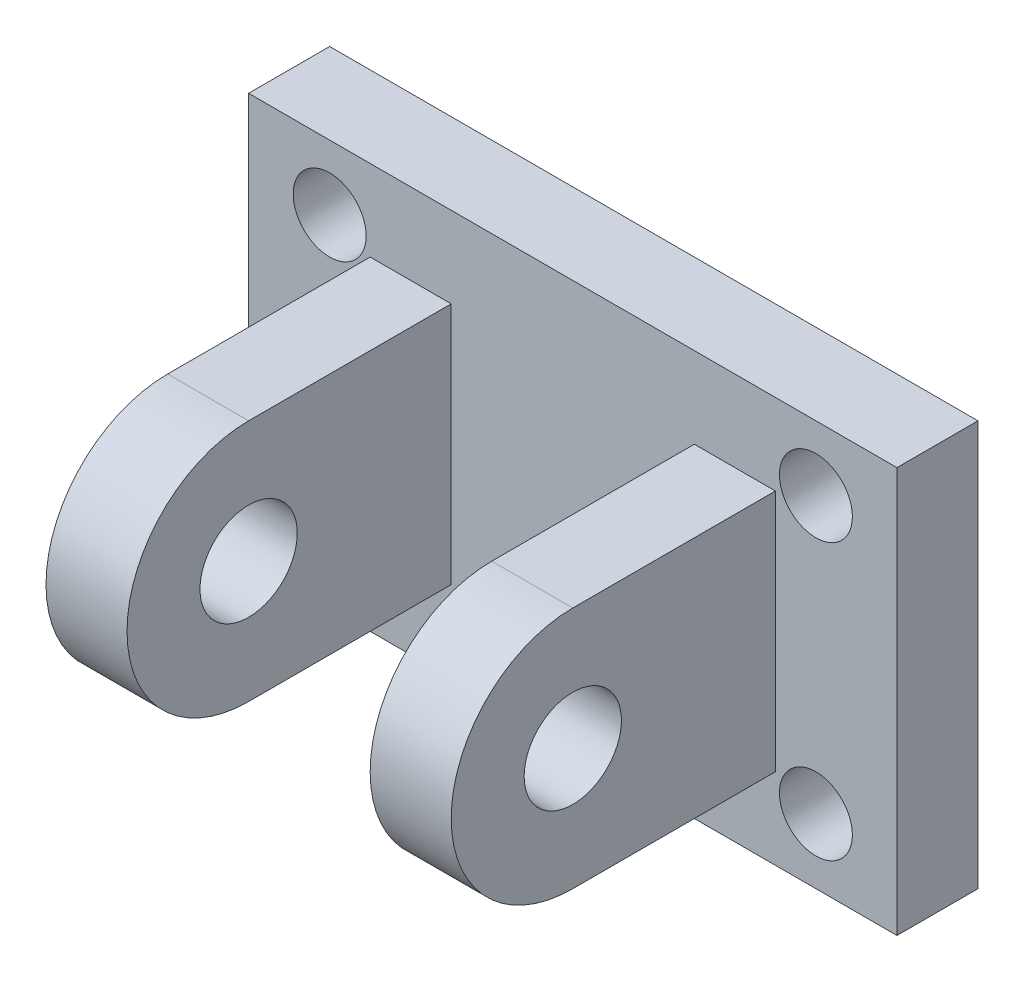
ISO-10303-21;
HEADER;
FILE_DESCRIPTION(('STEP AP214'),'2;1');
FILE_NAME('part.step','',(''),(''),'','','');
FILE_SCHEMA(('AUTOMOTIVE_DESIGN { 1 0 10303 214 1 1 1 1 }'));
ENDSEC;
DATA;
#1=APPLICATION_CONTEXT('core data for automotive mechanical design processes');
#2=APPLICATION_PROTOCOL_DEFINITION('international standard','automotive_design',2000,#1);
#3=PRODUCT_CONTEXT('',#1,'mechanical');
#4=PRODUCT('Part','Part','',(#3));
#5=PRODUCT_RELATED_PRODUCT_CATEGORY('part','',(#4));
#6=PRODUCT_DEFINITION_FORMATION('','',#4);
#7=PRODUCT_DEFINITION_CONTEXT('part definition',#1,'design');
#8=PRODUCT_DEFINITION('design','',#6,#7);
#9=PRODUCT_DEFINITION_SHAPE('','',#8);
#10=(LENGTH_UNIT() NAMED_UNIT(*) SI_UNIT(.MILLI.,.METRE.));
#11=(NAMED_UNIT(*) PLANE_ANGLE_UNIT() SI_UNIT($,.RADIAN.));
#12=(NAMED_UNIT(*) SI_UNIT($,.STERADIAN.) SOLID_ANGLE_UNIT());
#13=UNCERTAINTY_MEASURE_WITH_UNIT(LENGTH_MEASURE(1.E-05),#10,'distance_accuracy_value','');
#14=(GEOMETRIC_REPRESENTATION_CONTEXT(3) GLOBAL_UNCERTAINTY_ASSIGNED_CONTEXT((#13)) GLOBAL_UNIT_ASSIGNED_CONTEXT((#10,
#11,#12)) REPRESENTATION_CONTEXT('',''));
#15=CARTESIAN_POINT('',(0.,0.,0.));
#16=DIRECTION('',(0.,0.,1.));
#17=DIRECTION('',(1.,0.,0.));
#18=AXIS2_PLACEMENT_3D('',#15,#16,#17);
#19=CARTESIAN_POINT('',(0.,0.,10.));
#20=DIRECTION('',(0.,0.,1.));
#21=DIRECTION('',(1.,0.,0.));
#22=AXIS2_PLACEMENT_3D('',#19,#20,#21);
#23=PLANE('',#22);
#24=CARTESIAN_POINT('',(30.,-17.,10.));
#25=DIRECTION('',(0.,0.,1.));
#26=DIRECTION('',(1.,0.,0.));
#27=AXIS2_PLACEMENT_3D('',#24,#25,#26);
#28=CIRCLE('',#27,4.5);
#29=CARTESIAN_POINT('',(34.5,-17.,10.));
#30=VERTEX_POINT('',#29);
#31=EDGE_CURVE('E581',#30,#30,#28,.F.);
#32=ORIENTED_EDGE('',*,*,#31,.T.);
#33=EDGE_LOOP('',(#32));
#34=FACE_BOUND('',#33,.T.);
#35=CARTESIAN_POINT('',(-30.,17.,10.));
#36=DIRECTION('',(0.,0.,1.));
#37=DIRECTION('',(1.,0.,0.));
#38=AXIS2_PLACEMENT_3D('',#35,#36,#37);
#39=CIRCLE('',#38,4.5);
#40=CARTESIAN_POINT('',(-25.5,17.,10.));
#41=VERTEX_POINT('',#40);
#42=EDGE_CURVE('E587',#41,#41,#39,.F.);
#43=ORIENTED_EDGE('',*,*,#42,.T.);
#44=EDGE_LOOP('',(#43));
#45=FACE_BOUND('',#44,.T.);
#46=CARTESIAN_POINT('',(-30.,-17.,10.));
#47=DIRECTION('',(0.,0.,1.));
#48=DIRECTION('',(1.,0.,0.));
#49=AXIS2_PLACEMENT_3D('',#46,#47,#48);
#50=CIRCLE('',#49,4.5);
#51=CARTESIAN_POINT('',(-25.5,-17.,10.));
#52=VERTEX_POINT('',#51);
#53=EDGE_CURVE('E599',#52,#52,#50,.F.);
#54=ORIENTED_EDGE('',*,*,#53,.T.);
#55=EDGE_LOOP('',(#54));
#56=FACE_BOUND('',#55,.T.);
#57=CARTESIAN_POINT('',(30.,17.,10.));
#58=DIRECTION('',(0.,0.,1.));
#59=DIRECTION('',(1.,0.,0.));
#60=AXIS2_PLACEMENT_3D('',#57,#58,#59);
#61=CIRCLE('',#60,4.5);
#62=CARTESIAN_POINT('',(34.5,17.,10.));
#63=VERTEX_POINT('',#62);
#64=EDGE_CURVE('E597',#63,#63,#61,.F.);
#65=ORIENTED_EDGE('',*,*,#64,.T.);
#66=EDGE_LOOP('',(#65));
#67=FACE_BOUND('',#66,.T.);
#68=DIRECTION('',(0.,-1.,0.));
#69=VECTOR('',#68,1.);
#70=CARTESIAN_POINT('',(-40.,25.,10.));
#71=LINE('',#70,#69);
#72=CARTESIAN_POINT('',(-40.,25.,10.));
#73=VERTEX_POINT('',#72);
#74=CARTESIAN_POINT('',(-40.,-25.,10.));
#75=VERTEX_POINT('',#74);
#76=EDGE_CURVE('E210',#73,#75,#71,.T.);
#77=ORIENTED_EDGE('',*,*,#76,.T.);
#78=DIRECTION('',(1.,0.,0.));
#79=VECTOR('',#78,1.);
#80=CARTESIAN_POINT('',(-40.,-25.,10.));
#81=LINE('',#80,#79);
#82=CARTESIAN_POINT('',(40.,-25.,10.));
#83=VERTEX_POINT('',#82);
#84=EDGE_CURVE('E214',#75,#83,#81,.T.);
#85=ORIENTED_EDGE('',*,*,#84,.T.);
#86=DIRECTION('',(0.,1.,0.));
#87=VECTOR('',#86,1.);
#88=CARTESIAN_POINT('',(40.,-25.,10.));
#89=LINE('',#88,#87);
#90=CARTESIAN_POINT('',(40.,25.,10.));
#91=VERTEX_POINT('',#90);
#92=EDGE_CURVE('E218',#83,#91,#89,.T.);
#93=ORIENTED_EDGE('',*,*,#92,.T.);
#94=DIRECTION('',(-1.,0.,0.));
#95=VECTOR('',#94,1.);
#96=CARTESIAN_POINT('',(40.,25.,10.));
#97=LINE('',#96,#95);
#98=EDGE_CURVE('E221',#91,#73,#97,.T.);
#99=ORIENTED_EDGE('',*,*,#98,.T.);
#100=EDGE_LOOP('',(#77,#85,#93,#99));
#101=FACE_BOUND('',#100,.T.);
#102=DIRECTION('',(1.,0.,0.));
#103=VECTOR('',#102,1.);
#104=CARTESIAN_POINT('',(0.,15.,10.));
#105=LINE('',#104,#103);
#106=CARTESIAN_POINT('',(15.,15.,10.));
#107=VERTEX_POINT('',#106);
#108=CARTESIAN_POINT('',(25.,15.,10.));
#109=VERTEX_POINT('',#108);
#110=EDGE_CURVE('E258',#107,#109,#105,.T.);
#111=ORIENTED_EDGE('',*,*,#110,.T.);
#112=DIRECTION('',(0.,-1.,0.));
#113=VECTOR('',#112,1.);
#114=CARTESIAN_POINT('',(25.,0.,10.));
#115=LINE('',#114,#113);
#116=CARTESIAN_POINT('',(25.,-15.,10.));
#117=VERTEX_POINT('',#116);
#118=EDGE_CURVE('E261',#109,#117,#115,.T.);
#119=ORIENTED_EDGE('',*,*,#118,.T.);
#120=DIRECTION('',(-1.,0.,0.));
#121=VECTOR('',#120,1.);
#122=CARTESIAN_POINT('',(0.,-15.,10.));
#123=LINE('',#122,#121);
#124=CARTESIAN_POINT('',(15.,-15.,10.));
#125=VERTEX_POINT('',#124);
#126=EDGE_CURVE('E255',#117,#125,#123,.T.);
#127=ORIENTED_EDGE('',*,*,#126,.T.);
#128=DIRECTION('',(0.,-1.,0.));
#129=VECTOR('',#128,1.);
#130=CARTESIAN_POINT('',(15.,0.,10.));
#131=LINE('',#130,#129);
#132=EDGE_CURVE('E251',#107,#125,#131,.T.);
#133=ORIENTED_EDGE('',*,*,#132,.F.);
#134=EDGE_LOOP('',(#111,#119,#127,#133));
#135=FACE_BOUND('',#134,.T.);
#136=DIRECTION('',(1.,0.,0.));
#137=VECTOR('',#136,1.);
#138=CARTESIAN_POINT('',(0.,-15.,10.));
#139=LINE('',#138,#137);
#140=CARTESIAN_POINT('',(-25.,-15.,10.));
#141=VERTEX_POINT('',#140);
#142=CARTESIAN_POINT('',(-15.,-15.,10.));
#143=VERTEX_POINT('',#142);
#144=EDGE_CURVE('E62',#141,#143,#139,.T.);
#145=ORIENTED_EDGE('',*,*,#144,.F.);
#146=DIRECTION('',(0.,1.,0.));
#147=VECTOR('',#146,1.);
#148=CARTESIAN_POINT('',(-25.,0.,10.));
#149=LINE('',#148,#147);
#150=CARTESIAN_POINT('',(-25.,15.,10.));
#151=VERTEX_POINT('',#150);
#152=EDGE_CURVE('E11',#141,#151,#149,.T.);
#153=ORIENTED_EDGE('',*,*,#152,.T.);
#154=DIRECTION('',(-1.,0.,0.));
#155=VECTOR('',#154,1.);
#156=CARTESIAN_POINT('',(0.,15.,10.));
#157=LINE('',#156,#155);
#158=CARTESIAN_POINT('',(-15.,15.,10.));
#159=VERTEX_POINT('',#158);
#160=EDGE_CURVE('E267',#159,#151,#157,.T.);
#161=ORIENTED_EDGE('',*,*,#160,.F.);
#162=DIRECTION('',(0.,1.,0.));
#163=VECTOR('',#162,1.);
#164=CARTESIAN_POINT('',(-15.,0.,10.));
#165=LINE('',#164,#163);
#166=EDGE_CURVE('E264',#143,#159,#165,.T.);
#167=ORIENTED_EDGE('',*,*,#166,.F.);
#168=EDGE_LOOP('',(#145,#153,#161,#167));
#169=FACE_BOUND('',#168,.T.);
#170=ADVANCED_FACE('F51',(#34,#45,#56,#67,#101,#135,#169),#23,.T.);
#171=CARTESIAN_POINT('',(-40.,25.,10.));
#172=DIRECTION('',(1.,0.,0.));
#173=DIRECTION('',(0.,0.,-1.));
#174=AXIS2_PLACEMENT_3D('',#171,#172,#173);
#175=PLANE('',#174);
#176=DIRECTION('',(0.,-1.,0.));
#177=VECTOR('',#176,1.);
#178=CARTESIAN_POINT('',(-40.,25.,0.));
#179=LINE('',#178,#177);
#180=CARTESIAN_POINT('',(-40.,25.,0.));
#181=VERTEX_POINT('',#180);
#182=CARTESIAN_POINT('',(-40.,-25.,0.));
#183=VERTEX_POINT('',#182);
#184=EDGE_CURVE('E209',#181,#183,#179,.T.);
#185=ORIENTED_EDGE('',*,*,#184,.T.);
#186=DIRECTION('',(0.,0.,-1.));
#187=VECTOR('',#186,1.);
#188=CARTESIAN_POINT('',(-40.,-25.,10.));
#189=LINE('',#188,#187);
#190=EDGE_CURVE('E247',#75,#183,#189,.T.);
#191=ORIENTED_EDGE('',*,*,#190,.F.);
#192=ORIENTED_EDGE('',*,*,#76,.F.);
#193=DIRECTION('',(0.,0.,-1.));
#194=VECTOR('',#193,1.);
#195=CARTESIAN_POINT('',(-40.,25.,10.));
#196=LINE('',#195,#194);
#197=EDGE_CURVE('E224',#73,#181,#196,.T.);
#198=ORIENTED_EDGE('',*,*,#197,.T.);
#199=EDGE_LOOP('',(#185,#191,#192,#198));
#200=FACE_BOUND('',#199,.T.);
#201=ADVANCED_FACE('F54',(#200),#175,.F.);
#202=CARTESIAN_POINT('',(-40.,-25.,10.));
#203=DIRECTION('',(0.,1.,0.));
#204=DIRECTION('',(0.,0.,1.));
#205=AXIS2_PLACEMENT_3D('',#202,#203,#204);
#206=PLANE('',#205);
#207=DIRECTION('',(1.,0.,0.));
#208=VECTOR('',#207,1.);
#209=CARTESIAN_POINT('',(-40.,-25.,0.));
#210=LINE('',#209,#208);
#211=CARTESIAN_POINT('',(40.,-25.,0.));
#212=VERTEX_POINT('',#211);
#213=EDGE_CURVE('E228',#183,#212,#210,.T.);
#214=ORIENTED_EDGE('',*,*,#213,.T.);
#215=DIRECTION('',(0.,0.,-1.));
#216=VECTOR('',#215,1.);
#217=CARTESIAN_POINT('',(40.,-25.,10.));
#218=LINE('',#217,#216);
#219=EDGE_CURVE('E243',#83,#212,#218,.T.);
#220=ORIENTED_EDGE('',*,*,#219,.F.);
#221=ORIENTED_EDGE('',*,*,#84,.F.);
#222=ORIENTED_EDGE('',*,*,#190,.T.);
#223=EDGE_LOOP('',(#214,#220,#221,#222));
#224=FACE_BOUND('',#223,.T.);
#225=ADVANCED_FACE('F281',(#224),#206,.F.);
#226=CARTESIAN_POINT('',(40.,-25.,10.));
#227=DIRECTION('',(-1.,0.,0.));
#228=DIRECTION('',(0.,0.,1.));
#229=AXIS2_PLACEMENT_3D('',#226,#227,#228);
#230=PLANE('',#229);
#231=DIRECTION('',(0.,1.,0.));
#232=VECTOR('',#231,1.);
#233=CARTESIAN_POINT('',(40.,-25.,0.));
#234=LINE('',#233,#232);
#235=CARTESIAN_POINT('',(40.,25.,0.));
#236=VERTEX_POINT('',#235);
#237=EDGE_CURVE('E231',#212,#236,#234,.T.);
#238=ORIENTED_EDGE('',*,*,#237,.T.);
#239=DIRECTION('',(0.,0.,-1.));
#240=VECTOR('',#239,1.);
#241=CARTESIAN_POINT('',(40.,25.,10.));
#242=LINE('',#241,#240);
#243=EDGE_CURVE('E239',#91,#236,#242,.T.);
#244=ORIENTED_EDGE('',*,*,#243,.F.);
#245=ORIENTED_EDGE('',*,*,#92,.F.);
#246=ORIENTED_EDGE('',*,*,#219,.T.);
#247=EDGE_LOOP('',(#238,#244,#245,#246));
#248=FACE_BOUND('',#247,.T.);
#249=ADVANCED_FACE('F301',(#248),#230,.F.);
#250=CARTESIAN_POINT('',(40.,25.,10.));
#251=DIRECTION('',(0.,-1.,0.));
#252=DIRECTION('',(0.,0.,-1.));
#253=AXIS2_PLACEMENT_3D('',#250,#251,#252);
#254=PLANE('',#253);
#255=DIRECTION('',(-1.,0.,0.));
#256=VECTOR('',#255,1.);
#257=CARTESIAN_POINT('',(40.,25.,0.));
#258=LINE('',#257,#256);
#259=EDGE_CURVE('E215',#236,#181,#258,.T.);
#260=ORIENTED_EDGE('',*,*,#259,.T.);
#261=ORIENTED_EDGE('',*,*,#197,.F.);
#262=ORIENTED_EDGE('',*,*,#98,.F.);
#263=ORIENTED_EDGE('',*,*,#243,.T.);
#264=EDGE_LOOP('',(#260,#261,#262,#263));
#265=FACE_BOUND('',#264,.T.);
#266=ADVANCED_FACE('F296',(#265),#254,.F.);
#267=CARTESIAN_POINT('',(0.,0.,0.));
#268=DIRECTION('',(0.,0.,1.));
#269=DIRECTION('',(1.,0.,0.));
#270=AXIS2_PLACEMENT_3D('',#267,#268,#269);
#271=PLANE('',#270);
#272=CARTESIAN_POINT('',(30.,-17.,0.));
#273=DIRECTION('',(0.,0.,1.));
#274=DIRECTION('',(1.,0.,0.));
#275=AXIS2_PLACEMENT_3D('',#272,#273,#274);
#276=CIRCLE('',#275,4.5);
#277=CARTESIAN_POINT('',(34.5,-17.,0.));
#278=VERTEX_POINT('',#277);
#279=EDGE_CURVE('E604',#278,#278,#276,.T.);
#280=ORIENTED_EDGE('',*,*,#279,.T.);
#281=EDGE_LOOP('',(#280));
#282=FACE_BOUND('',#281,.T.);
#283=CARTESIAN_POINT('',(-30.,17.,0.));
#284=DIRECTION('',(0.,0.,1.));
#285=DIRECTION('',(1.,0.,0.));
#286=AXIS2_PLACEMENT_3D('',#283,#284,#285);
#287=CIRCLE('',#286,4.5);
#288=CARTESIAN_POINT('',(-25.5,17.,0.));
#289=VERTEX_POINT('',#288);
#290=EDGE_CURVE('E602',#289,#289,#287,.T.);
#291=ORIENTED_EDGE('',*,*,#290,.T.);
#292=EDGE_LOOP('',(#291));
#293=FACE_BOUND('',#292,.T.);
#294=CARTESIAN_POINT('',(-30.,-17.,0.));
#295=DIRECTION('',(0.,0.,1.));
#296=DIRECTION('',(1.,0.,0.));
#297=AXIS2_PLACEMENT_3D('',#294,#295,#296);
#298=CIRCLE('',#297,4.5);
#299=CARTESIAN_POINT('',(-25.5,-17.,0.));
#300=VERTEX_POINT('',#299);
#301=EDGE_CURVE('E605',#300,#300,#298,.T.);
#302=ORIENTED_EDGE('',*,*,#301,.T.);
#303=EDGE_LOOP('',(#302));
#304=FACE_BOUND('',#303,.T.);
#305=CARTESIAN_POINT('',(30.,17.,0.));
#306=DIRECTION('',(0.,0.,1.));
#307=DIRECTION('',(1.,0.,0.));
#308=AXIS2_PLACEMENT_3D('',#305,#306,#307);
#309=CIRCLE('',#308,4.5);
#310=CARTESIAN_POINT('',(34.5,17.,0.));
#311=VERTEX_POINT('',#310);
#312=EDGE_CURVE('E600',#311,#311,#309,.T.);
#313=ORIENTED_EDGE('',*,*,#312,.T.);
#314=EDGE_LOOP('',(#313));
#315=FACE_BOUND('',#314,.T.);
#316=ORIENTED_EDGE('',*,*,#184,.F.);
#317=ORIENTED_EDGE('',*,*,#259,.F.);
#318=ORIENTED_EDGE('',*,*,#237,.F.);
#319=ORIENTED_EDGE('',*,*,#213,.F.);
#320=EDGE_LOOP('',(#316,#317,#318,#319));
#321=FACE_BOUND('',#320,.T.);
#322=ADVANCED_FACE('F292',(#282,#293,#304,#315,#321),#271,.F.);
#323=CARTESIAN_POINT('',(25.,15.,35.));
#324=DIRECTION('',(0.,-1.,0.));
#325=DIRECTION('',(0.,0.,-1.));
#326=AXIS2_PLACEMENT_3D('',#323,#324,#325);
#327=PLANE('',#326);
#328=ORIENTED_EDGE('',*,*,#110,.F.);
#329=DIRECTION('',(0.,0.,1.));
#330=VECTOR('',#329,1.);
#331=CARTESIAN_POINT('',(15.,15.,35.));
#332=LINE('',#331,#330);
#333=CARTESIAN_POINT('',(15.,15.,35.));
#334=VERTEX_POINT('',#333);
#335=EDGE_CURVE('E149',#107,#334,#332,.T.);
#336=ORIENTED_EDGE('',*,*,#335,.T.);
#337=DIRECTION('',(-1.,0.,0.));
#338=VECTOR('',#337,1.);
#339=CARTESIAN_POINT('',(25.,15.,35.));
#340=LINE('',#339,#338);
#341=CARTESIAN_POINT('',(25.,15.,35.));
#342=VERTEX_POINT('',#341);
#343=EDGE_CURVE('E205',#342,#334,#340,.T.);
#344=ORIENTED_EDGE('',*,*,#343,.F.);
#345=DIRECTION('',(0.,0.,1.));
#346=VECTOR('',#345,1.);
#347=CARTESIAN_POINT('',(25.,15.,35.));
#348=LINE('',#347,#346);
#349=EDGE_CURVE('E182',#109,#342,#348,.T.);
#350=ORIENTED_EDGE('',*,*,#349,.F.);
#351=EDGE_LOOP('',(#328,#336,#344,#350));
#352=FACE_BOUND('',#351,.T.);
#353=ADVANCED_FACE('F289',(#352),#327,.F.);
#354=CARTESIAN_POINT('',(25.,0.,35.));
#355=DIRECTION('',(-1.,0.,0.));
#356=DIRECTION('',(0.,0.,1.));
#357=AXIS2_PLACEMENT_3D('',#354,#355,#356);
#358=CYLINDRICAL_SURFACE('',#357,15.);
#359=CARTESIAN_POINT('',(15.,0.,35.));
#360=DIRECTION('',(1.,0.,0.));
#361=DIRECTION('',(0.,0.,1.));
#362=AXIS2_PLACEMENT_3D('',#359,#360,#361);
#363=CIRCLE('',#362,15.);
#364=CARTESIAN_POINT('',(15.,-15.,35.));
#365=VERTEX_POINT('',#364);
#366=EDGE_CURVE('E196',#334,#365,#363,.T.);
#367=ORIENTED_EDGE('',*,*,#366,.T.);
#368=DIRECTION('',(-1.,0.,0.));
#369=VECTOR('',#368,1.);
#370=CARTESIAN_POINT('',(25.,-15.,35.));
#371=LINE('',#370,#369);
#372=CARTESIAN_POINT('',(25.,-15.,35.));
#373=VERTEX_POINT('',#372);
#374=EDGE_CURVE('E193',#373,#365,#371,.T.);
#375=ORIENTED_EDGE('',*,*,#374,.F.);
#376=CARTESIAN_POINT('',(25.,0.,35.));
#377=DIRECTION('',(1.,0.,0.));
#378=DIRECTION('',(0.,0.,1.));
#379=AXIS2_PLACEMENT_3D('',#376,#377,#378);
#380=CIRCLE('',#379,15.);
#381=EDGE_CURVE('E185',#342,#373,#380,.T.);
#382=ORIENTED_EDGE('',*,*,#381,.F.);
#383=ORIENTED_EDGE('',*,*,#343,.T.);
#384=EDGE_LOOP('',(#367,#375,#382,#383));
#385=FACE_BOUND('',#384,.T.);
#386=ADVANCED_FACE('F336',(#385),#358,.T.);
#387=CARTESIAN_POINT('',(25.,-15.,9.5));
#388=DIRECTION('',(0.,1.,0.));
#389=DIRECTION('',(0.,0.,1.));
#390=AXIS2_PLACEMENT_3D('',#387,#388,#389);
#391=PLANE('',#390);
#392=ORIENTED_EDGE('',*,*,#126,.F.);
#393=DIRECTION('',(0.,0.,-1.));
#394=VECTOR('',#393,1.);
#395=CARTESIAN_POINT('',(25.,-15.,9.5));
#396=LINE('',#395,#394);
#397=EDGE_CURVE('E189',#373,#117,#396,.T.);
#398=ORIENTED_EDGE('',*,*,#397,.F.);
#399=ORIENTED_EDGE('',*,*,#374,.T.);
#400=DIRECTION('',(0.,0.,-1.));
#401=VECTOR('',#400,1.);
#402=CARTESIAN_POINT('',(15.,-15.,9.5));
#403=LINE('',#402,#401);
#404=EDGE_CURVE('E186',#365,#125,#403,.T.);
#405=ORIENTED_EDGE('',*,*,#404,.T.);
#406=EDGE_LOOP('',(#392,#398,#399,#405));
#407=FACE_BOUND('',#406,.T.);
#408=ADVANCED_FACE('F339',(#407),#391,.F.);
#409=CARTESIAN_POINT('',(25.,0.,35.));
#410=DIRECTION('',(-1.,0.,0.));
#411=DIRECTION('',(0.,0.,1.));
#412=AXIS2_PLACEMENT_3D('',#409,#410,#411);
#413=PLANE('',#412);
#414=CARTESIAN_POINT('',(25.,0.,35.));
#415=DIRECTION('',(-1.,0.,0.));
#416=DIRECTION('',(0.,0.,1.));
#417=AXIS2_PLACEMENT_3D('',#414,#415,#416);
#418=CIRCLE('',#417,6.);
#419=CARTESIAN_POINT('',(25.,0.,41.));
#420=VERTEX_POINT('',#419);
#421=EDGE_CURVE('E175',#420,#420,#418,.F.);
#422=ORIENTED_EDGE('',*,*,#421,.F.);
#423=EDGE_LOOP('',(#422));
#424=FACE_BOUND('',#423,.T.);
#425=ORIENTED_EDGE('',*,*,#118,.F.);
#426=ORIENTED_EDGE('',*,*,#349,.T.);
#427=ORIENTED_EDGE('',*,*,#381,.T.);
#428=ORIENTED_EDGE('',*,*,#397,.T.);
#429=EDGE_LOOP('',(#425,#426,#427,#428));
#430=FACE_BOUND('',#429,.T.);
#431=ADVANCED_FACE('F329',(#424,#430),#413,.F.);
#432=CARTESIAN_POINT('',(15.,0.,35.));
#433=DIRECTION('',(-1.,0.,0.));
#434=DIRECTION('',(0.,0.,1.));
#435=AXIS2_PLACEMENT_3D('',#432,#433,#434);
#436=PLANE('',#435);
#437=CARTESIAN_POINT('',(15.,0.,35.));
#438=DIRECTION('',(-1.,0.,0.));
#439=DIRECTION('',(0.,0.,1.));
#440=AXIS2_PLACEMENT_3D('',#437,#438,#439);
#441=CIRCLE('',#440,6.);
#442=CARTESIAN_POINT('',(15.,0.,41.));
#443=VERTEX_POINT('',#442);
#444=EDGE_CURVE('E585',#443,#443,#441,.F.);
#445=ORIENTED_EDGE('',*,*,#444,.T.);
#446=EDGE_LOOP('',(#445));
#447=FACE_BOUND('',#446,.T.);
#448=ORIENTED_EDGE('',*,*,#335,.F.);
#449=ORIENTED_EDGE('',*,*,#132,.T.);
#450=ORIENTED_EDGE('',*,*,#404,.F.);
#451=ORIENTED_EDGE('',*,*,#366,.F.);
#452=EDGE_LOOP('',(#448,#449,#450,#451));
#453=FACE_BOUND('',#452,.T.);
#454=ADVANCED_FACE('F341',(#447,#453),#436,.T.);
#455=CARTESIAN_POINT('',(-25.,-15.,9.5));
#456=DIRECTION('',(0.,-1.,0.));
#457=DIRECTION('',(0.,0.,-1.));
#458=AXIS2_PLACEMENT_3D('',#455,#456,#457);
#459=PLANE('',#458);
#460=DIRECTION('',(0.,0.,-1.));
#461=VECTOR('',#460,1.);
#462=CARTESIAN_POINT('',(-25.,-15.,9.5));
#463=LINE('',#462,#461);
#464=CARTESIAN_POINT('',(-25.,-15.,35.));
#465=VERTEX_POINT('',#464);
#466=EDGE_CURVE('E141',#465,#141,#463,.T.);
#467=ORIENTED_EDGE('',*,*,#466,.T.);
#468=ORIENTED_EDGE('',*,*,#144,.T.);
#469=DIRECTION('',(0.,0.,-1.));
#470=VECTOR('',#469,1.);
#471=CARTESIAN_POINT('',(-15.,-15.,9.5));
#472=LINE('',#471,#470);
#473=CARTESIAN_POINT('',(-15.,-15.,35.));
#474=VERTEX_POINT('',#473);
#475=EDGE_CURVE('E143',#474,#143,#472,.T.);
#476=ORIENTED_EDGE('',*,*,#475,.F.);
#477=DIRECTION('',(1.,0.,0.));
#478=VECTOR('',#477,1.);
#479=CARTESIAN_POINT('',(-25.,-15.,35.));
#480=LINE('',#479,#478);
#481=EDGE_CURVE('E138',#465,#474,#480,.T.);
#482=ORIENTED_EDGE('',*,*,#481,.F.);
#483=EDGE_LOOP('',(#467,#468,#476,#482));
#484=FACE_BOUND('',#483,.T.);
#485=ADVANCED_FACE('F140',(#484),#459,.T.);
#486=CARTESIAN_POINT('',(-25.,0.,35.));
#487=DIRECTION('',(1.,0.,0.));
#488=DIRECTION('',(0.,0.,-1.));
#489=AXIS2_PLACEMENT_3D('',#486,#487,#488);
#490=CYLINDRICAL_SURFACE('',#489,15.);
#491=CARTESIAN_POINT('',(-15.,0.,35.));
#492=DIRECTION('',(1.,0.,0.));
#493=DIRECTION('',(0.,0.,1.));
#494=AXIS2_PLACEMENT_3D('',#491,#492,#493);
#495=CIRCLE('',#494,15.);
#496=CARTESIAN_POINT('',(-15.,15.,35.));
#497=VERTEX_POINT('',#496);
#498=EDGE_CURVE('E174',#497,#474,#495,.T.);
#499=ORIENTED_EDGE('',*,*,#498,.F.);
#500=DIRECTION('',(1.,0.,0.));
#501=VECTOR('',#500,1.);
#502=CARTESIAN_POINT('',(-25.,15.,35.));
#503=LINE('',#502,#501);
#504=CARTESIAN_POINT('',(-25.,15.,35.));
#505=VERTEX_POINT('',#504);
#506=EDGE_CURVE('E150',#505,#497,#503,.T.);
#507=ORIENTED_EDGE('',*,*,#506,.F.);
#508=CARTESIAN_POINT('',(-25.,0.,35.));
#509=DIRECTION('',(1.,0.,0.));
#510=DIRECTION('',(0.,0.,1.));
#511=AXIS2_PLACEMENT_3D('',#508,#509,#510);
#512=CIRCLE('',#511,15.);
#513=EDGE_CURVE('E156',#505,#465,#512,.T.);
#514=ORIENTED_EDGE('',*,*,#513,.T.);
#515=ORIENTED_EDGE('',*,*,#481,.T.);
#516=EDGE_LOOP('',(#499,#507,#514,#515));
#517=FACE_BOUND('',#516,.T.);
#518=ADVANCED_FACE('F161',(#517),#490,.T.);
#519=CARTESIAN_POINT('',(-25.,15.,35.));
#520=DIRECTION('',(0.,1.,0.));
#521=DIRECTION('',(0.,0.,1.));
#522=AXIS2_PLACEMENT_3D('',#519,#520,#521);
#523=PLANE('',#522);
#524=DIRECTION('',(0.,0.,1.));
#525=VECTOR('',#524,1.);
#526=CARTESIAN_POINT('',(-15.,15.,35.));
#527=LINE('',#526,#525);
#528=EDGE_CURVE('E158',#159,#497,#527,.T.);
#529=ORIENTED_EDGE('',*,*,#528,.F.);
#530=ORIENTED_EDGE('',*,*,#160,.T.);
#531=DIRECTION('',(0.,0.,1.));
#532=VECTOR('',#531,1.);
#533=CARTESIAN_POINT('',(-25.,15.,35.));
#534=LINE('',#533,#532);
#535=EDGE_CURVE('E164',#151,#505,#534,.T.);
#536=ORIENTED_EDGE('',*,*,#535,.T.);
#537=ORIENTED_EDGE('',*,*,#506,.T.);
#538=EDGE_LOOP('',(#529,#530,#536,#537));
#539=FACE_BOUND('',#538,.T.);
#540=ADVANCED_FACE('F275',(#539),#523,.T.);
#541=CARTESIAN_POINT('',(-25.,0.,35.));
#542=DIRECTION('',(1.,0.,0.));
#543=DIRECTION('',(0.,0.,1.));
#544=AXIS2_PLACEMENT_3D('',#541,#542,#543);
#545=PLANE('',#544);
#546=CARTESIAN_POINT('',(-25.,0.,35.));
#547=DIRECTION('',(1.,0.,0.));
#548=DIRECTION('',(0.,0.,-1.));
#549=AXIS2_PLACEMENT_3D('',#546,#547,#548);
#550=CIRCLE('',#549,6.);
#551=CARTESIAN_POINT('',(-25.,0.,29.));
#552=VERTEX_POINT('',#551);
#553=EDGE_CURVE('E578',#552,#552,#550,.T.);
#554=ORIENTED_EDGE('',*,*,#553,.T.);
#555=EDGE_LOOP('',(#554));
#556=FACE_BOUND('',#555,.T.);
#557=ORIENTED_EDGE('',*,*,#152,.F.);
#558=ORIENTED_EDGE('',*,*,#466,.F.);
#559=ORIENTED_EDGE('',*,*,#513,.F.);
#560=ORIENTED_EDGE('',*,*,#535,.F.);
#561=EDGE_LOOP('',(#557,#558,#559,#560));
#562=FACE_BOUND('',#561,.T.);
#563=ADVANCED_FACE('F154',(#556,#562),#545,.F.);
#564=CARTESIAN_POINT('',(-15.,0.,35.));
#565=DIRECTION('',(1.,0.,0.));
#566=DIRECTION('',(0.,0.,1.));
#567=AXIS2_PLACEMENT_3D('',#564,#565,#566);
#568=PLANE('',#567);
#569=CARTESIAN_POINT('',(-15.,0.,35.));
#570=DIRECTION('',(1.,0.,0.));
#571=DIRECTION('',(0.,0.,-1.));
#572=AXIS2_PLACEMENT_3D('',#569,#570,#571);
#573=CIRCLE('',#572,6.);
#574=CARTESIAN_POINT('',(-15.,0.,29.));
#575=VERTEX_POINT('',#574);
#576=EDGE_CURVE('E56',#575,#575,#573,.F.);
#577=ORIENTED_EDGE('',*,*,#576,.T.);
#578=EDGE_LOOP('',(#577));
#579=FACE_BOUND('',#578,.T.);
#580=ORIENTED_EDGE('',*,*,#475,.T.);
#581=ORIENTED_EDGE('',*,*,#166,.T.);
#582=ORIENTED_EDGE('',*,*,#528,.T.);
#583=ORIENTED_EDGE('',*,*,#498,.T.);
#584=EDGE_LOOP('',(#580,#581,#582,#583));
#585=FACE_BOUND('',#584,.T.);
#586=ADVANCED_FACE('F272',(#579,#585),#568,.T.);
#587=CARTESIAN_POINT('',(40.,0.,35.));
#588=DIRECTION('',(-1.,0.,0.));
#589=DIRECTION('',(0.,0.,1.));
#590=AXIS2_PLACEMENT_3D('',#587,#588,#589);
#591=CYLINDRICAL_SURFACE('',#590,6.);
#592=ORIENTED_EDGE('',*,*,#576,.F.);
#593=EDGE_LOOP('',(#592));
#594=FACE_BOUND('',#593,.T.);
#595=ORIENTED_EDGE('',*,*,#553,.F.);
#596=EDGE_LOOP('',(#595));
#597=FACE_BOUND('',#596,.T.);
#598=ADVANCED_FACE('F446',(#594,#597),#591,.F.);
#599=ORIENTED_EDGE('',*,*,#444,.F.);
#600=EDGE_LOOP('',(#599));
#601=FACE_BOUND('',#600,.T.);
#602=ORIENTED_EDGE('',*,*,#421,.T.);
#603=EDGE_LOOP('',(#602));
#604=FACE_BOUND('',#603,.T.);
#605=ADVANCED_FACE('F388',(#601,#604),#591,.F.);
#606=CARTESIAN_POINT('',(30.,17.,50.));
#607=DIRECTION('',(0.,0.,-1.));
#608=DIRECTION('',(-1.,0.,0.));
#609=AXIS2_PLACEMENT_3D('',#606,#607,#608);
#610=CYLINDRICAL_SURFACE('',#609,4.5);
#611=ORIENTED_EDGE('',*,*,#64,.F.);
#612=EDGE_LOOP('',(#611));
#613=FACE_BOUND('',#612,.T.);
#614=ORIENTED_EDGE('',*,*,#312,.F.);
#615=EDGE_LOOP('',(#614));
#616=FACE_BOUND('',#615,.T.);
#617=ADVANCED_FACE('F401',(#613,#616),#610,.F.);
#618=CARTESIAN_POINT('',(-30.,-17.,50.));
#619=DIRECTION('',(0.,0.,-1.));
#620=DIRECTION('',(-1.,0.,0.));
#621=AXIS2_PLACEMENT_3D('',#618,#619,#620);
#622=CYLINDRICAL_SURFACE('',#621,4.5);
#623=ORIENTED_EDGE('',*,*,#53,.F.);
#624=EDGE_LOOP('',(#623));
#625=FACE_BOUND('',#624,.T.);
#626=ORIENTED_EDGE('',*,*,#301,.F.);
#627=EDGE_LOOP('',(#626));
#628=FACE_BOUND('',#627,.T.);
#629=ADVANCED_FACE('F407',(#625,#628),#622,.F.);
#630=CARTESIAN_POINT('',(-30.,17.,50.));
#631=DIRECTION('',(0.,0.,-1.));
#632=DIRECTION('',(-1.,0.,0.));
#633=AXIS2_PLACEMENT_3D('',#630,#631,#632);
#634=CYLINDRICAL_SURFACE('',#633,4.5);
#635=ORIENTED_EDGE('',*,*,#42,.F.);
#636=EDGE_LOOP('',(#635));
#637=FACE_BOUND('',#636,.T.);
#638=ORIENTED_EDGE('',*,*,#290,.F.);
#639=EDGE_LOOP('',(#638));
#640=FACE_BOUND('',#639,.T.);
#641=ADVANCED_FACE('F418',(#637,#640),#634,.F.);
#642=CARTESIAN_POINT('',(30.,-17.,50.));
#643=DIRECTION('',(0.,0.,-1.));
#644=DIRECTION('',(-1.,0.,0.));
#645=AXIS2_PLACEMENT_3D('',#642,#643,#644);
#646=CYLINDRICAL_SURFACE('',#645,4.5);
#647=ORIENTED_EDGE('',*,*,#31,.F.);
#648=EDGE_LOOP('',(#647));
#649=FACE_BOUND('',#648,.T.);
#650=ORIENTED_EDGE('',*,*,#279,.F.);
#651=EDGE_LOOP('',(#650));
#652=FACE_BOUND('',#651,.T.);
#653=ADVANCED_FACE('F429',(#649,#652),#646,.F.);
#654=CLOSED_SHELL('',(#170,#201,#225,#249,#266,#322,#353,#386,#408,#431,#454,#485,#518,#540,
#563,#586,#598,#605,#617,#629,#641,#653));
#655=MANIFOLD_SOLID_BREP('B2',#654);
#656=ADVANCED_BREP_SHAPE_REPRESENTATION('',(#18,#655),#14);
#657=SHAPE_DEFINITION_REPRESENTATION(#9,#656);
ENDSEC;
END-ISO-10303-21;
